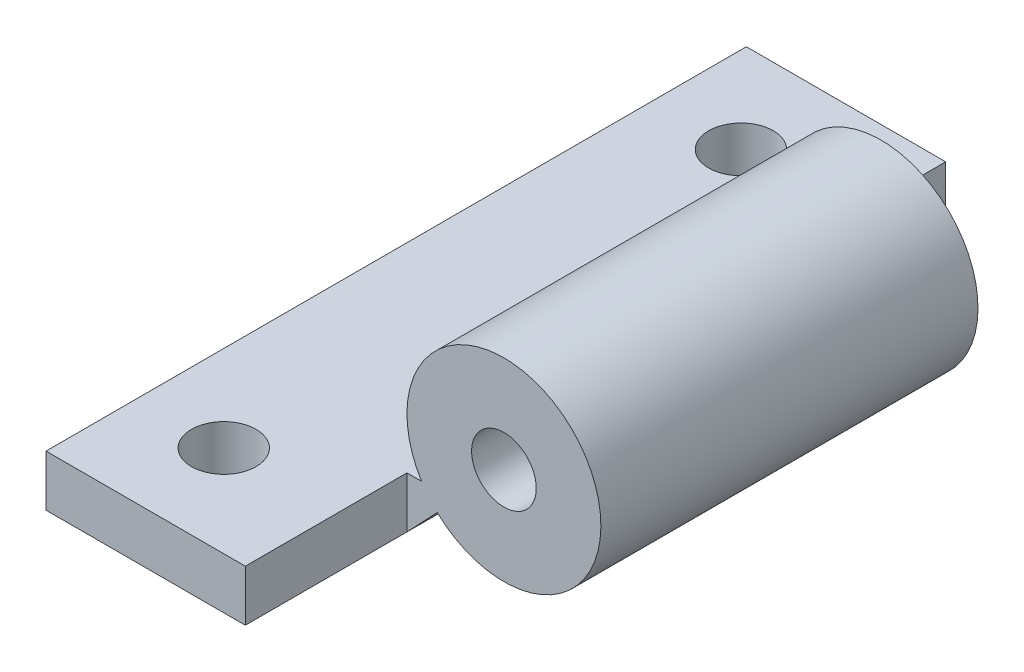
ISO-10303-21;
HEADER;
FILE_DESCRIPTION(('STEP AP214'),'2;1');
FILE_NAME('part.step','',(''),(''),'','','');
FILE_SCHEMA(('AUTOMOTIVE_DESIGN { 1 0 10303 214 1 1 1 1 }'));
ENDSEC;
DATA;
#1=APPLICATION_CONTEXT('core data for automotive mechanical design processes');
#2=APPLICATION_PROTOCOL_DEFINITION('international standard','automotive_design',2000,#1);
#3=PRODUCT_CONTEXT('',#1,'mechanical');
#4=PRODUCT('Part','Part','',(#3));
#5=PRODUCT_RELATED_PRODUCT_CATEGORY('part','',(#4));
#6=PRODUCT_DEFINITION_FORMATION('','',#4);
#7=PRODUCT_DEFINITION_CONTEXT('part definition',#1,'design');
#8=PRODUCT_DEFINITION('design','',#6,#7);
#9=PRODUCT_DEFINITION_SHAPE('','',#8);
#10=(LENGTH_UNIT() NAMED_UNIT(*) SI_UNIT(.MILLI.,.METRE.));
#11=(NAMED_UNIT(*) PLANE_ANGLE_UNIT() SI_UNIT($,.RADIAN.));
#12=(NAMED_UNIT(*) SI_UNIT($,.STERADIAN.) SOLID_ANGLE_UNIT());
#13=UNCERTAINTY_MEASURE_WITH_UNIT(LENGTH_MEASURE(1.E-05),#10,'distance_accuracy_value','');
#14=(GEOMETRIC_REPRESENTATION_CONTEXT(3) GLOBAL_UNCERTAINTY_ASSIGNED_CONTEXT((#13)) GLOBAL_UNIT_ASSIGNED_CONTEXT((#10,
#11,#12)) REPRESENTATION_CONTEXT('',''));
#15=CARTESIAN_POINT('',(0.,0.,0.));
#16=DIRECTION('',(0.,0.,1.));
#17=DIRECTION('',(1.,0.,0.));
#18=AXIS2_PLACEMENT_3D('',#15,#16,#17);
#19=CARTESIAN_POINT('',(-7.64444242571033,4.75,65.));
#20=DIRECTION('',(0.,-1.,0.));
#21=DIRECTION('',(1.,0.,0.));
#22=AXIS2_PLACEMENT_3D('',#19,#20,#21);
#23=PLANE('',#22);
#24=DIRECTION('',(0.,0.,-1.));
#25=VECTOR('',#24,1.);
#26=CARTESIAN_POINT('',(-7.64444242571033,4.75,65.));
#27=LINE('',#26,#25);
#28=CARTESIAN_POINT('',(-7.64444242571033,4.75,50.));
#29=VERTEX_POINT('',#28);
#30=CARTESIAN_POINT('',(-7.64444242571033,4.75,15.));
#31=VERTEX_POINT('',#30);
#32=EDGE_CURVE('E106',#29,#31,#27,.T.);
#33=ORIENTED_EDGE('',*,*,#32,.T.);
#34=DIRECTION('',(-1.,0.,0.));
#35=VECTOR('',#34,1.);
#36=CARTESIAN_POINT('',(-7.64444242571033,4.75,15.));
#37=LINE('',#36,#35);
#38=CARTESIAN_POINT('',(-9.,4.75,15.));
#39=VERTEX_POINT('',#38);
#40=EDGE_CURVE('E195',#31,#39,#37,.T.);
#41=ORIENTED_EDGE('',*,*,#40,.T.);
#42=DIRECTION('',(0.,0.,-1.));
#43=VECTOR('',#42,1.);
#44=CARTESIAN_POINT('',(-9.,4.75,65.));
#45=LINE('',#44,#43);
#46=CARTESIAN_POINT('',(-9.,4.75,0.));
#47=VERTEX_POINT('',#46);
#48=EDGE_CURVE('E95',#39,#47,#45,.T.);
#49=ORIENTED_EDGE('',*,*,#48,.T.);
#50=DIRECTION('',(-1.,0.,0.));
#51=VECTOR('',#50,1.);
#52=CARTESIAN_POINT('',(-7.64444242571033,4.75,0.));
#53=LINE('',#52,#51);
#54=CARTESIAN_POINT('',(-27.5,4.75,0.));
#55=VERTEX_POINT('',#54);
#56=EDGE_CURVE('E103',#47,#55,#53,.T.);
#57=ORIENTED_EDGE('',*,*,#56,.T.);
#58=DIRECTION('',(0.,0.,-1.));
#59=VECTOR('',#58,1.);
#60=CARTESIAN_POINT('',(-27.5,4.75,65.));
#61=LINE('',#60,#59);
#62=CARTESIAN_POINT('',(-27.5,4.75,65.));
#63=VERTEX_POINT('',#62);
#64=EDGE_CURVE('E135',#63,#55,#61,.T.);
#65=ORIENTED_EDGE('',*,*,#64,.F.);
#66=DIRECTION('',(-1.,0.,0.));
#67=VECTOR('',#66,1.);
#68=CARTESIAN_POINT('',(-7.64444242571033,4.75,65.));
#69=LINE('',#68,#67);
#70=CARTESIAN_POINT('',(-9.,4.75,65.));
#71=VERTEX_POINT('',#70);
#72=EDGE_CURVE('E114',#71,#63,#69,.T.);
#73=ORIENTED_EDGE('',*,*,#72,.F.);
#74=DIRECTION('',(0.,0.,-1.));
#75=VECTOR('',#74,1.);
#76=CARTESIAN_POINT('',(-9.,4.75,65.));
#77=LINE('',#76,#75);
#78=CARTESIAN_POINT('',(-9.,4.75,50.));
#79=VERTEX_POINT('',#78);
#80=EDGE_CURVE('E54',#71,#79,#77,.T.);
#81=ORIENTED_EDGE('',*,*,#80,.T.);
#82=DIRECTION('',(1.,0.,0.));
#83=VECTOR('',#82,1.);
#84=CARTESIAN_POINT('',(-7.64444242571033,4.75,50.));
#85=LINE('',#84,#83);
#86=EDGE_CURVE('E206',#79,#29,#85,.T.);
#87=ORIENTED_EDGE('',*,*,#86,.T.);
#88=EDGE_LOOP('',(#33,#41,#49,#57,#65,#73,#81,#87));
#89=FACE_BOUND('',#88,.T.);
#90=CARTESIAN_POINT('',(-19.5,4.75,56.5));
#91=DIRECTION('',(0.,-1.,0.));
#92=DIRECTION('',(1.,0.,0.));
#93=AXIS2_PLACEMENT_3D('',#90,#91,#92);
#94=CIRCLE('',#93,3.);
#95=CARTESIAN_POINT('',(-16.5,4.75,56.5));
#96=VERTEX_POINT('',#95);
#97=EDGE_CURVE('E201',#96,#96,#94,.T.);
#98=ORIENTED_EDGE('',*,*,#97,.T.);
#99=EDGE_LOOP('',(#98));
#100=FACE_BOUND('',#99,.T.);
#101=CARTESIAN_POINT('',(-19.5,4.75,8.5));
#102=DIRECTION('',(0.,1.,0.));
#103=DIRECTION('',(-1.,0.,0.));
#104=AXIS2_PLACEMENT_3D('',#101,#102,#103);
#105=CIRCLE('',#104,3.);
#106=CARTESIAN_POINT('',(-22.5,4.75,8.5));
#107=VERTEX_POINT('',#106);
#108=EDGE_CURVE('E147',#107,#107,#105,.T.);
#109=ORIENTED_EDGE('',*,*,#108,.F.);
#110=EDGE_LOOP('',(#109));
#111=FACE_BOUND('',#110,.T.);
#112=ADVANCED_FACE('F38',(#89,#100,#111),#23,.F.);
#113=CARTESIAN_POINT('',(-27.5,0.,65.));
#114=DIRECTION('',(0.,1.,0.));
#115=DIRECTION('',(0.,0.,1.));
#116=AXIS2_PLACEMENT_3D('',#113,#114,#115);
#117=PLANE('',#116);
#118=DIRECTION('',(1.,0.,0.));
#119=VECTOR('',#118,1.);
#120=CARTESIAN_POINT('',(-27.5,0.,0.));
#121=LINE('',#120,#119);
#122=CARTESIAN_POINT('',(-27.5,0.,0.));
#123=VERTEX_POINT('',#122);
#124=CARTESIAN_POINT('',(-9.,0.,0.));
#125=VERTEX_POINT('',#124);
#126=EDGE_CURVE('E102',#123,#125,#121,.T.);
#127=ORIENTED_EDGE('',*,*,#126,.T.);
#128=DIRECTION('',(0.,0.,1.));
#129=VECTOR('',#128,1.);
#130=CARTESIAN_POINT('',(-9.,0.,65.));
#131=LINE('',#130,#129);
#132=CARTESIAN_POINT('',(-9.,0.,15.));
#133=VERTEX_POINT('',#132);
#134=EDGE_CURVE('E80',#125,#133,#131,.T.);
#135=ORIENTED_EDGE('',*,*,#134,.T.);
#136=DIRECTION('',(0.,0.,-1.));
#137=VECTOR('',#136,1.);
#138=CARTESIAN_POINT('',(-9.,0.,65.));
#139=LINE('',#138,#137);
#140=CARTESIAN_POINT('',(-9.,0.,50.));
#141=VERTEX_POINT('',#140);
#142=EDGE_CURVE('E127',#141,#133,#139,.T.);
#143=ORIENTED_EDGE('',*,*,#142,.F.);
#144=CARTESIAN_POINT('',(-9.,0.,65.));
#145=VERTEX_POINT('',#144);
#146=EDGE_CURVE('E129',#145,#141,#139,.T.);
#147=ORIENTED_EDGE('',*,*,#146,.F.);
#148=DIRECTION('',(1.,0.,0.));
#149=VECTOR('',#148,1.);
#150=CARTESIAN_POINT('',(-27.5,0.,65.));
#151=LINE('',#150,#149);
#152=CARTESIAN_POINT('',(-27.5,0.,65.));
#153=VERTEX_POINT('',#152);
#154=EDGE_CURVE('E128',#153,#145,#151,.T.);
#155=ORIENTED_EDGE('',*,*,#154,.F.);
#156=DIRECTION('',(0.,0.,-1.));
#157=VECTOR('',#156,1.);
#158=CARTESIAN_POINT('',(-27.5,0.,65.));
#159=LINE('',#158,#157);
#160=EDGE_CURVE('E112',#153,#123,#159,.T.);
#161=ORIENTED_EDGE('',*,*,#160,.T.);
#162=EDGE_LOOP('',(#127,#135,#143,#147,#155,#161));
#163=FACE_BOUND('',#162,.T.);
#164=CARTESIAN_POINT('',(-19.5,0.,56.5));
#165=DIRECTION('',(0.,1.,0.));
#166=DIRECTION('',(0.,0.,1.));
#167=AXIS2_PLACEMENT_3D('',#164,#165,#166);
#168=CIRCLE('',#167,3.);
#169=CARTESIAN_POINT('',(-19.5,0.,59.5));
#170=VERTEX_POINT('',#169);
#171=EDGE_CURVE('E142',#170,#170,#168,.F.);
#172=ORIENTED_EDGE('',*,*,#171,.F.);
#173=EDGE_LOOP('',(#172));
#174=FACE_BOUND('',#173,.T.);
#175=CARTESIAN_POINT('',(-19.5,0.,8.5));
#176=DIRECTION('',(0.,1.,0.));
#177=DIRECTION('',(0.,0.,1.));
#178=AXIS2_PLACEMENT_3D('',#175,#176,#177);
#179=CIRCLE('',#178,3.);
#180=CARTESIAN_POINT('',(-19.5,0.,11.5));
#181=VERTEX_POINT('',#180);
#182=EDGE_CURVE('E146',#181,#181,#179,.T.);
#183=ORIENTED_EDGE('',*,*,#182,.T.);
#184=EDGE_LOOP('',(#183));
#185=FACE_BOUND('',#184,.T.);
#186=ADVANCED_FACE('F109',(#163,#174,#185),#117,.F.);
#187=CARTESIAN_POINT('',(0.,9.5,65.));
#188=DIRECTION('',(0.,0.,-1.));
#189=DIRECTION('',(-1.,0.,0.));
#190=AXIS2_PLACEMENT_3D('',#187,#188,#189);
#191=CYLINDRICAL_SURFACE('',#190,9.);
#192=DIRECTION('',(0.,0.,-1.));
#193=VECTOR('',#192,1.);
#194=CARTESIAN_POINT('',(-6.18970183119705,2.96642584484756,65.));
#195=LINE('',#194,#193);
#196=CARTESIAN_POINT('',(-6.18970183119705,2.96642584484756,50.));
#197=VERTEX_POINT('',#196);
#198=CARTESIAN_POINT('',(-6.18970183119705,2.96642584484756,15.));
#199=VERTEX_POINT('',#198);
#200=EDGE_CURVE('E123',#197,#199,#195,.T.);
#201=ORIENTED_EDGE('',*,*,#200,.T.);
#202=CARTESIAN_POINT('',(0.,9.5,15.));
#203=DIRECTION('',(0.,0.,1.));
#204=DIRECTION('',(1.,0.,0.));
#205=AXIS2_PLACEMENT_3D('',#202,#203,#204);
#206=CIRCLE('',#205,9.);
#207=EDGE_CURVE('E199',#199,#31,#206,.T.);
#208=ORIENTED_EDGE('',*,*,#207,.T.);
#209=ORIENTED_EDGE('',*,*,#32,.F.);
#210=CARTESIAN_POINT('',(0.,9.5,50.));
#211=DIRECTION('',(0.,0.,-1.));
#212=DIRECTION('',(-1.,0.,0.));
#213=AXIS2_PLACEMENT_3D('',#210,#211,#212);
#214=CIRCLE('',#213,9.);
#215=EDGE_CURVE('E210',#29,#197,#214,.T.);
#216=ORIENTED_EDGE('',*,*,#215,.T.);
#217=EDGE_LOOP('',(#201,#208,#209,#216));
#218=FACE_BOUND('',#217,.T.);
#219=ADVANCED_FACE('F40',(#218),#191,.T.);
#220=CARTESIAN_POINT('',(-27.5,4.75,65.));
#221=DIRECTION('',(1.,0.,0.));
#222=DIRECTION('',(0.,0.,-1.));
#223=AXIS2_PLACEMENT_3D('',#220,#221,#222);
#224=PLANE('',#223);
#225=DIRECTION('',(0.,-1.,0.));
#226=VECTOR('',#225,1.);
#227=CARTESIAN_POINT('',(-27.5,4.75,0.));
#228=LINE('',#227,#226);
#229=EDGE_CURVE('E115',#55,#123,#228,.T.);
#230=ORIENTED_EDGE('',*,*,#229,.T.);
#231=ORIENTED_EDGE('',*,*,#160,.F.);
#232=DIRECTION('',(0.,-1.,0.));
#233=VECTOR('',#232,1.);
#234=CARTESIAN_POINT('',(-27.5,4.75,65.));
#235=LINE('',#234,#233);
#236=EDGE_CURVE('E63',#63,#153,#235,.T.);
#237=ORIENTED_EDGE('',*,*,#236,.F.);
#238=ORIENTED_EDGE('',*,*,#64,.T.);
#239=EDGE_LOOP('',(#230,#231,#237,#238));
#240=FACE_BOUND('',#239,.T.);
#241=ADVANCED_FACE('F181',(#240),#224,.F.);
#242=CARTESIAN_POINT('',(-9.,0.,65.));
#243=DIRECTION('',(-0.725952683905826,0.687744647910783,0.));
#244=DIRECTION('',(-0.687744647910783,-0.725952683905827,0.));
#245=AXIS2_PLACEMENT_3D('',#242,#243,#244);
#246=PLANE('',#245);
#247=ORIENTED_EDGE('',*,*,#142,.T.);
#248=DIRECTION('',(0.687744647910783,0.725952683905827,0.));
#249=VECTOR('',#248,1.);
#250=CARTESIAN_POINT('',(-9.,0.,15.));
#251=LINE('',#250,#249);
#252=EDGE_CURVE('E11',#133,#199,#251,.T.);
#253=ORIENTED_EDGE('',*,*,#252,.T.);
#254=ORIENTED_EDGE('',*,*,#200,.F.);
#255=DIRECTION('',(-0.687744647910783,-0.725952683905827,0.));
#256=VECTOR('',#255,1.);
#257=CARTESIAN_POINT('',(-9.,0.,50.));
#258=LINE('',#257,#256);
#259=EDGE_CURVE('E47',#197,#141,#258,.T.);
#260=ORIENTED_EDGE('',*,*,#259,.T.);
#261=EDGE_LOOP('',(#247,#253,#254,#260));
#262=FACE_BOUND('',#261,.T.);
#263=ADVANCED_FACE('F158',(#262),#246,.F.);
#264=CARTESIAN_POINT('',(0.,9.5,65.));
#265=DIRECTION('',(0.,0.,1.));
#266=DIRECTION('',(1.,0.,0.));
#267=AXIS2_PLACEMENT_3D('',#264,#265,#266);
#268=PLANE('',#267);
#269=DIRECTION('',(0.,-1.,0.));
#270=VECTOR('',#269,1.);
#271=CARTESIAN_POINT('',(-9.,9.5,65.));
#272=LINE('',#271,#270);
#273=EDGE_CURVE('E105',#71,#145,#272,.T.);
#274=ORIENTED_EDGE('',*,*,#273,.F.);
#275=ORIENTED_EDGE('',*,*,#72,.T.);
#276=ORIENTED_EDGE('',*,*,#236,.T.);
#277=ORIENTED_EDGE('',*,*,#154,.T.);
#278=EDGE_LOOP('',(#274,#275,#276,#277));
#279=FACE_BOUND('',#278,.T.);
#280=ADVANCED_FACE('F182',(#279),#268,.T.);
#281=CARTESIAN_POINT('',(0.,9.5,0.));
#282=DIRECTION('',(0.,0.,1.));
#283=DIRECTION('',(1.,0.,0.));
#284=AXIS2_PLACEMENT_3D('',#281,#282,#283);
#285=PLANE('',#284);
#286=ORIENTED_EDGE('',*,*,#56,.F.);
#287=DIRECTION('',(0.,-1.,0.));
#288=VECTOR('',#287,1.);
#289=CARTESIAN_POINT('',(-9.,9.5,0.));
#290=LINE('',#289,#288);
#291=EDGE_CURVE('E85',#47,#125,#290,.T.);
#292=ORIENTED_EDGE('',*,*,#291,.T.);
#293=ORIENTED_EDGE('',*,*,#126,.F.);
#294=ORIENTED_EDGE('',*,*,#229,.F.);
#295=EDGE_LOOP('',(#286,#292,#293,#294));
#296=FACE_BOUND('',#295,.T.);
#297=ADVANCED_FACE('F100',(#296),#285,.F.);
#298=CARTESIAN_POINT('',(-19.5,-60.25,56.5));
#299=DIRECTION('',(0.,1.,0.));
#300=DIRECTION('',(-1.,0.,0.));
#301=AXIS2_PLACEMENT_3D('',#298,#299,#300);
#302=CYLINDRICAL_SURFACE('',#301,3.);
#303=ORIENTED_EDGE('',*,*,#97,.F.);
#304=EDGE_LOOP('',(#303));
#305=FACE_BOUND('',#304,.T.);
#306=ORIENTED_EDGE('',*,*,#171,.T.);
#307=EDGE_LOOP('',(#306));
#308=FACE_BOUND('',#307,.T.);
#309=ADVANCED_FACE('F223',(#305,#308),#302,.F.);
#310=CARTESIAN_POINT('',(-19.5,-60.25,8.5));
#311=DIRECTION('',(0.,1.,0.));
#312=DIRECTION('',(-1.,0.,0.));
#313=AXIS2_PLACEMENT_3D('',#310,#311,#312);
#314=CYLINDRICAL_SURFACE('',#313,3.);
#315=ORIENTED_EDGE('',*,*,#108,.T.);
#316=EDGE_LOOP('',(#315));
#317=FACE_BOUND('',#316,.T.);
#318=ORIENTED_EDGE('',*,*,#182,.F.);
#319=EDGE_LOOP('',(#318));
#320=FACE_BOUND('',#319,.T.);
#321=ADVANCED_FACE('F226',(#317,#320),#314,.F.);
#322=CARTESIAN_POINT('',(-8.99999999999999,-20.25,15.));
#323=DIRECTION('',(0.,0.,1.));
#324=DIRECTION('',(1.,0.,0.));
#325=AXIS2_PLACEMENT_3D('',#322,#323,#324);
#326=PLANE('',#325);
#327=CARTESIAN_POINT('',(0.,9.5,15.));
#328=DIRECTION('',(0.,0.,1.));
#329=DIRECTION('',(1.,0.,0.));
#330=AXIS2_PLACEMENT_3D('',#327,#328,#329);
#331=CIRCLE('',#330,3.);
#332=CARTESIAN_POINT('',(3.,9.5,15.));
#333=VERTEX_POINT('',#332);
#334=EDGE_CURVE('E314',#333,#333,#331,.T.);
#335=ORIENTED_EDGE('',*,*,#334,.T.);
#336=EDGE_LOOP('',(#335));
#337=FACE_BOUND('',#336,.T.);
#338=ORIENTED_EDGE('',*,*,#207,.F.);
#339=ORIENTED_EDGE('',*,*,#252,.F.);
#340=DIRECTION('',(0.,1.,0.));
#341=VECTOR('',#340,1.);
#342=CARTESIAN_POINT('',(-8.99999999999999,-20.25,15.));
#343=LINE('',#342,#341);
#344=EDGE_CURVE('E89',#133,#39,#343,.T.);
#345=ORIENTED_EDGE('',*,*,#344,.T.);
#346=ORIENTED_EDGE('',*,*,#40,.F.);
#347=EDGE_LOOP('',(#338,#339,#345,#346));
#348=FACE_BOUND('',#347,.T.);
#349=ADVANCED_FACE('F197',(#337,#348),#326,.F.);
#350=CARTESIAN_POINT('',(-8.99999999999999,-20.25,0.));
#351=DIRECTION('',(-1.,0.,0.));
#352=DIRECTION('',(0.,-1.,0.));
#353=AXIS2_PLACEMENT_3D('',#350,#351,#352);
#354=PLANE('',#353);
#355=ORIENTED_EDGE('',*,*,#344,.F.);
#356=ORIENTED_EDGE('',*,*,#134,.F.);
#357=ORIENTED_EDGE('',*,*,#291,.F.);
#358=ORIENTED_EDGE('',*,*,#48,.F.);
#359=EDGE_LOOP('',(#355,#356,#357,#358));
#360=FACE_BOUND('',#359,.T.);
#361=ADVANCED_FACE('F82',(#360),#354,.F.);
#362=CARTESIAN_POINT('',(-9.,-20.25,50.));
#363=DIRECTION('',(0.,0.,-1.));
#364=DIRECTION('',(-1.,0.,0.));
#365=AXIS2_PLACEMENT_3D('',#362,#363,#364);
#366=PLANE('',#365);
#367=CARTESIAN_POINT('',(0.,9.5,50.));
#368=DIRECTION('',(0.,0.,1.));
#369=DIRECTION('',(1.,0.,0.));
#370=AXIS2_PLACEMENT_3D('',#367,#368,#369);
#371=CIRCLE('',#370,3.);
#372=CARTESIAN_POINT('',(3.,9.5,50.));
#373=VERTEX_POINT('',#372);
#374=EDGE_CURVE('E311',#373,#373,#371,.T.);
#375=ORIENTED_EDGE('',*,*,#374,.F.);
#376=EDGE_LOOP('',(#375));
#377=FACE_BOUND('',#376,.T.);
#378=DIRECTION('',(0.,1.,0.));
#379=VECTOR('',#378,1.);
#380=CARTESIAN_POINT('',(-9.,-20.25,50.));
#381=LINE('',#380,#379);
#382=EDGE_CURVE('E316',#141,#79,#381,.T.);
#383=ORIENTED_EDGE('',*,*,#382,.F.);
#384=ORIENTED_EDGE('',*,*,#259,.F.);
#385=ORIENTED_EDGE('',*,*,#215,.F.);
#386=ORIENTED_EDGE('',*,*,#86,.F.);
#387=EDGE_LOOP('',(#383,#384,#385,#386));
#388=FACE_BOUND('',#387,.T.);
#389=ADVANCED_FACE('F270',(#377,#388),#366,.F.);
#390=CARTESIAN_POINT('',(-8.99999999999999,-20.25,65.));
#391=DIRECTION('',(-1.,0.,0.));
#392=DIRECTION('',(0.,-1.,0.));
#393=AXIS2_PLACEMENT_3D('',#390,#391,#392);
#394=PLANE('',#393);
#395=ORIENTED_EDGE('',*,*,#273,.T.);
#396=ORIENTED_EDGE('',*,*,#146,.T.);
#397=ORIENTED_EDGE('',*,*,#382,.T.);
#398=ORIENTED_EDGE('',*,*,#80,.F.);
#399=EDGE_LOOP('',(#395,#396,#397,#398));
#400=FACE_BOUND('',#399,.T.);
#401=ADVANCED_FACE('F278',(#400),#394,.F.);
#402=CARTESIAN_POINT('',(0.,9.5,0.));
#403=DIRECTION('',(0.,0.,1.));
#404=DIRECTION('',(1.,0.,0.));
#405=AXIS2_PLACEMENT_3D('',#402,#403,#404);
#406=CYLINDRICAL_SURFACE('',#405,3.);
#407=ORIENTED_EDGE('',*,*,#374,.T.);
#408=EDGE_LOOP('',(#407));
#409=FACE_BOUND('',#408,.T.);
#410=ORIENTED_EDGE('',*,*,#334,.F.);
#411=EDGE_LOOP('',(#410));
#412=FACE_BOUND('',#411,.T.);
#413=ADVANCED_FACE('F283',(#409,#412),#406,.F.);
#414=CLOSED_SHELL('',(#112,#186,#219,#241,#263,#280,#297,#309,#321,#349,#361,#389,#401,#413));
#415=MANIFOLD_SOLID_BREP('B2',#414);
#416=ADVANCED_BREP_SHAPE_REPRESENTATION('',(#18,#415),#14);
#417=SHAPE_DEFINITION_REPRESENTATION(#9,#416);
ENDSEC;
END-ISO-10303-21;
